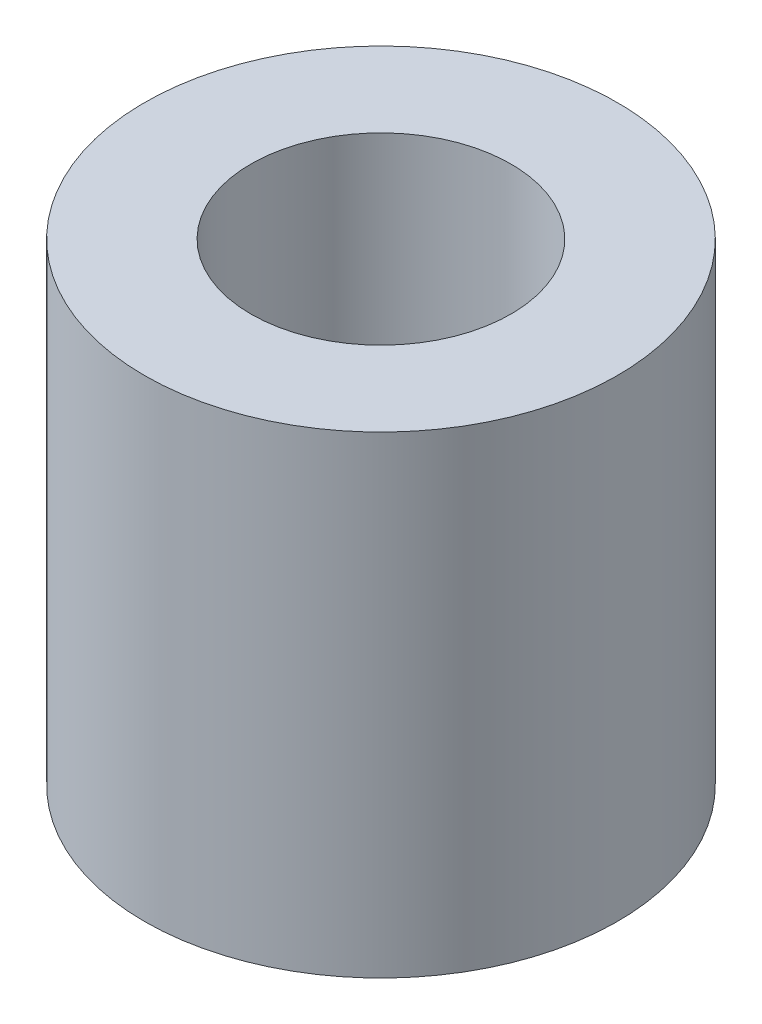
ISO-10303-21;
HEADER;
FILE_DESCRIPTION(('STEP AP214'),'2;1');
FILE_NAME('part.step','',(''),(''),'','','');
FILE_SCHEMA(('AUTOMOTIVE_DESIGN { 1 0 10303 214 1 1 1 1 }'));
ENDSEC;
DATA;
#1=APPLICATION_CONTEXT('core data for automotive mechanical design processes');
#2=APPLICATION_PROTOCOL_DEFINITION('international standard','automotive_design',2000,#1);
#3=PRODUCT_CONTEXT('',#1,'mechanical');
#4=PRODUCT('Part','Part','',(#3));
#5=PRODUCT_RELATED_PRODUCT_CATEGORY('part','',(#4));
#6=PRODUCT_DEFINITION_FORMATION('','',#4);
#7=PRODUCT_DEFINITION_CONTEXT('part definition',#1,'design');
#8=PRODUCT_DEFINITION('design','',#6,#7);
#9=PRODUCT_DEFINITION_SHAPE('','',#8);
#10=(LENGTH_UNIT() NAMED_UNIT(*) SI_UNIT(.MILLI.,.METRE.));
#11=(NAMED_UNIT(*) PLANE_ANGLE_UNIT() SI_UNIT($,.RADIAN.));
#12=(NAMED_UNIT(*) SI_UNIT($,.STERADIAN.) SOLID_ANGLE_UNIT());
#13=UNCERTAINTY_MEASURE_WITH_UNIT(LENGTH_MEASURE(1.E-05),#10,'distance_accuracy_value','');
#14=(GEOMETRIC_REPRESENTATION_CONTEXT(3) GLOBAL_UNCERTAINTY_ASSIGNED_CONTEXT((#13)) GLOBAL_UNIT_ASSIGNED_CONTEXT((#10,
#11,#12)) REPRESENTATION_CONTEXT('',''));
#15=CARTESIAN_POINT('',(0.,0.,0.));
#16=DIRECTION('',(0.,0.,1.));
#17=DIRECTION('',(1.,0.,0.));
#18=AXIS2_PLACEMENT_3D('',#15,#16,#17);
#19=CARTESIAN_POINT('',(0.,6.,0.));
#20=DIRECTION('',(0.,-1.,0.));
#21=DIRECTION('',(0.,0.,-1.));
#22=AXIS2_PLACEMENT_3D('',#19,#20,#21);
#23=CYLINDRICAL_SURFACE('',#22,3.);
#24=CARTESIAN_POINT('',(0.,6.,0.));
#25=DIRECTION('',(0.,1.,0.));
#26=DIRECTION('',(0.,0.,1.));
#27=AXIS2_PLACEMENT_3D('',#24,#25,#26);
#28=CIRCLE('',#27,3.);
#29=CARTESIAN_POINT('',(0.,6.,3.));
#30=VERTEX_POINT('',#29);
#31=EDGE_CURVE('E10',#30,#30,#28,.T.);
#32=ORIENTED_EDGE('',*,*,#31,.F.);
#33=EDGE_LOOP('',(#32));
#34=FACE_BOUND('',#33,.T.);
#35=CARTESIAN_POINT('',(0.,0.,0.));
#36=DIRECTION('',(0.,1.,0.));
#37=DIRECTION('',(0.,0.,1.));
#38=AXIS2_PLACEMENT_3D('',#35,#36,#37);
#39=CIRCLE('',#38,3.);
#40=CARTESIAN_POINT('',(0.,0.,3.));
#41=VERTEX_POINT('',#40);
#42=EDGE_CURVE('E39',#41,#41,#39,.T.);
#43=ORIENTED_EDGE('',*,*,#42,.T.);
#44=EDGE_LOOP('',(#43));
#45=FACE_BOUND('',#44,.T.);
#46=ADVANCED_FACE('F36',(#34,#45),#23,.T.);
#47=CARTESIAN_POINT('',(0.,6.,0.));
#48=DIRECTION('',(0.,1.,0.));
#49=DIRECTION('',(0.,0.,1.));
#50=AXIS2_PLACEMENT_3D('',#47,#48,#49);
#51=PLANE('',#50);
#52=CARTESIAN_POINT('',(0.,6.,0.));
#53=DIRECTION('',(0.,1.,0.));
#54=DIRECTION('',(0.,0.,1.));
#55=AXIS2_PLACEMENT_3D('',#52,#53,#54);
#56=CIRCLE('',#55,1.65);
#57=CARTESIAN_POINT('',(0.,6.,1.65));
#58=VERTEX_POINT('',#57);
#59=EDGE_CURVE('E50',#58,#58,#56,.T.);
#60=ORIENTED_EDGE('',*,*,#59,.F.);
#61=EDGE_LOOP('',(#60));
#62=FACE_BOUND('',#61,.T.);
#63=ORIENTED_EDGE('',*,*,#31,.T.);
#64=EDGE_LOOP('',(#63));
#65=FACE_BOUND('',#64,.T.);
#66=ADVANCED_FACE('F56',(#62,#65),#51,.T.);
#67=CARTESIAN_POINT('',(0.,0.,0.));
#68=DIRECTION('',(0.,1.,0.));
#69=DIRECTION('',(0.,0.,1.));
#70=AXIS2_PLACEMENT_3D('',#67,#68,#69);
#71=PLANE('',#70);
#72=CARTESIAN_POINT('',(0.,0.,0.));
#73=DIRECTION('',(0.,1.,0.));
#74=DIRECTION('',(0.,0.,1.));
#75=AXIS2_PLACEMENT_3D('',#72,#73,#74);
#76=CIRCLE('',#75,1.65);
#77=CARTESIAN_POINT('',(0.,0.,1.65));
#78=VERTEX_POINT('',#77);
#79=EDGE_CURVE('E46',#78,#78,#76,.T.);
#80=ORIENTED_EDGE('',*,*,#79,.T.);
#81=EDGE_LOOP('',(#80));
#82=FACE_BOUND('',#81,.T.);
#83=ORIENTED_EDGE('',*,*,#42,.F.);
#84=EDGE_LOOP('',(#83));
#85=FACE_BOUND('',#84,.T.);
#86=ADVANCED_FACE('F58',(#82,#85),#71,.F.);
#87=CARTESIAN_POINT('',(0.,6.,0.));
#88=DIRECTION('',(0.,1.,0.));
#89=DIRECTION('',(0.,0.,1.));
#90=AXIS2_PLACEMENT_3D('',#87,#88,#89);
#91=CYLINDRICAL_SURFACE('',#90,1.65);
#92=ORIENTED_EDGE('',*,*,#79,.F.);
#93=EDGE_LOOP('',(#92));
#94=FACE_BOUND('',#93,.T.);
#95=ORIENTED_EDGE('',*,*,#59,.T.);
#96=EDGE_LOOP('',(#95));
#97=FACE_BOUND('',#96,.T.);
#98=ADVANCED_FACE('F54',(#94,#97),#91,.F.);
#99=CLOSED_SHELL('',(#46,#66,#86,#98));
#100=MANIFOLD_SOLID_BREP('B2',#99);
#101=ADVANCED_BREP_SHAPE_REPRESENTATION('',(#18,#100),#14);
#102=SHAPE_DEFINITION_REPRESENTATION(#9,#101);
ENDSEC;
END-ISO-10303-21;
